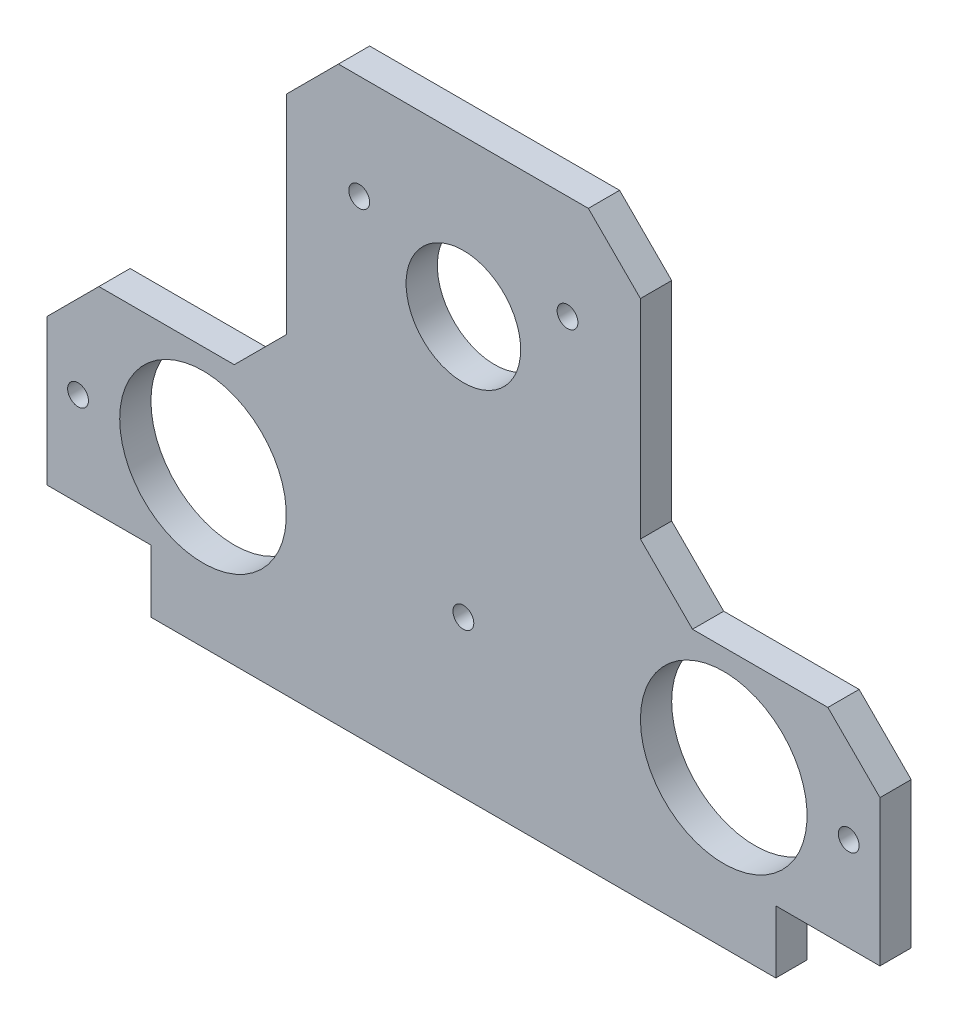
ISO-10303-21;
HEADER;
FILE_DESCRIPTION(('STEP AP214'),'2;1');
FILE_NAME('part.step','',(''),(''),'','','');
FILE_SCHEMA(('AUTOMOTIVE_DESIGN { 1 0 10303 214 1 1 1 1 }'));
ENDSEC;
DATA;
#1=APPLICATION_CONTEXT('core data for automotive mechanical design processes');
#2=APPLICATION_PROTOCOL_DEFINITION('international standard','automotive_design',2000,#1);
#3=PRODUCT_CONTEXT('',#1,'mechanical');
#4=PRODUCT('Part','Part','',(#3));
#5=PRODUCT_RELATED_PRODUCT_CATEGORY('part','',(#4));
#6=PRODUCT_DEFINITION_FORMATION('','',#4);
#7=PRODUCT_DEFINITION_CONTEXT('part definition',#1,'design');
#8=PRODUCT_DEFINITION('design','',#6,#7);
#9=PRODUCT_DEFINITION_SHAPE('','',#8);
#10=(LENGTH_UNIT() NAMED_UNIT(*) SI_UNIT(.MILLI.,.METRE.));
#11=(NAMED_UNIT(*) PLANE_ANGLE_UNIT() SI_UNIT($,.RADIAN.));
#12=(NAMED_UNIT(*) SI_UNIT($,.STERADIAN.) SOLID_ANGLE_UNIT());
#13=UNCERTAINTY_MEASURE_WITH_UNIT(LENGTH_MEASURE(1.E-05),#10,'distance_accuracy_value','');
#14=(GEOMETRIC_REPRESENTATION_CONTEXT(3) GLOBAL_UNCERTAINTY_ASSIGNED_CONTEXT((#13)) GLOBAL_UNIT_ASSIGNED_CONTEXT((#10,
#11,#12)) REPRESENTATION_CONTEXT('',''));
#15=CARTESIAN_POINT('',(0.,0.,0.));
#16=DIRECTION('',(0.,0.,1.));
#17=DIRECTION('',(1.,0.,0.));
#18=AXIS2_PLACEMENT_3D('',#15,#16,#17);
#19=CARTESIAN_POINT('',(0.,0.,0.));
#20=DIRECTION('',(0.,0.,1.));
#21=DIRECTION('',(1.,0.,0.));
#22=AXIS2_PLACEMENT_3D('',#19,#20,#21);
#23=PLANE('',#22);
#24=CARTESIAN_POINT('',(0.,15.,0.));
#25=DIRECTION('',(0.,0.,-1.));
#26=DIRECTION('',(-1.,0.,0.));
#27=AXIS2_PLACEMENT_3D('',#24,#25,#26);
#28=CIRCLE('',#27,1.);
#29=CARTESIAN_POINT('',(-1.,15.,0.));
#30=VERTEX_POINT('',#29);
#31=EDGE_CURVE('E341',#30,#30,#28,.T.);
#32=ORIENTED_EDGE('',*,*,#31,.F.);
#33=EDGE_LOOP('',(#32));
#34=FACE_BOUND('',#33,.T.);
#35=CARTESIAN_POINT('',(-37.,15.,0.));
#36=DIRECTION('',(0.,0.,-1.));
#37=DIRECTION('',(1.,0.,0.));
#38=AXIS2_PLACEMENT_3D('',#35,#36,#37);
#39=CIRCLE('',#38,0.999999999999998);
#40=CARTESIAN_POINT('',(-36.,15.,0.));
#41=VERTEX_POINT('',#40);
#42=EDGE_CURVE('E240',#41,#41,#39,.T.);
#43=ORIENTED_EDGE('',*,*,#42,.F.);
#44=EDGE_LOOP('',(#43));
#45=FACE_BOUND('',#44,.T.);
#46=CARTESIAN_POINT('',(37.,15.,0.));
#47=DIRECTION('',(0.,0.,-1.));
#48=DIRECTION('',(-1.,0.,0.));
#49=AXIS2_PLACEMENT_3D('',#46,#47,#48);
#50=CIRCLE('',#49,0.999999999999998);
#51=CARTESIAN_POINT('',(36.,15.,0.));
#52=VERTEX_POINT('',#51);
#53=EDGE_CURVE('E235',#52,#52,#50,.T.);
#54=ORIENTED_EDGE('',*,*,#53,.F.);
#55=EDGE_LOOP('',(#54));
#56=FACE_BOUND('',#55,.T.);
#57=CARTESIAN_POINT('',(-9.99999999999999,45.,0.));
#58=DIRECTION('',(0.,0.,-1.));
#59=DIRECTION('',(1.,0.,0.));
#60=AXIS2_PLACEMENT_3D('',#57,#58,#59);
#61=CIRCLE('',#60,1.);
#62=CARTESIAN_POINT('',(-8.99999999999999,45.,0.));
#63=VERTEX_POINT('',#62);
#64=EDGE_CURVE('E229',#63,#63,#61,.T.);
#65=ORIENTED_EDGE('',*,*,#64,.F.);
#66=EDGE_LOOP('',(#65));
#67=FACE_BOUND('',#66,.T.);
#68=CARTESIAN_POINT('',(10.,45.,0.));
#69=DIRECTION('',(0.,0.,-1.));
#70=DIRECTION('',(-1.,0.,0.));
#71=AXIS2_PLACEMENT_3D('',#68,#69,#70);
#72=CIRCLE('',#71,1.);
#73=CARTESIAN_POINT('',(9.,45.,0.));
#74=VERTEX_POINT('',#73);
#75=EDGE_CURVE('E226',#74,#74,#72,.T.);
#76=ORIENTED_EDGE('',*,*,#75,.F.);
#77=EDGE_LOOP('',(#76));
#78=FACE_BOUND('',#77,.T.);
#79=CARTESIAN_POINT('',(-25.,15.,0.));
#80=DIRECTION('',(0.,0.,-1.));
#81=DIRECTION('',(1.,0.,0.));
#82=AXIS2_PLACEMENT_3D('',#79,#80,#81);
#83=CIRCLE('',#82,8.);
#84=CARTESIAN_POINT('',(-17.,15.,0.));
#85=VERTEX_POINT('',#84);
#86=EDGE_CURVE('E268',#85,#85,#83,.T.);
#87=ORIENTED_EDGE('',*,*,#86,.F.);
#88=EDGE_LOOP('',(#87));
#89=FACE_BOUND('',#88,.T.);
#90=CARTESIAN_POINT('',(25.,15.,0.));
#91=DIRECTION('',(0.,0.,-1.));
#92=DIRECTION('',(-1.,0.,0.));
#93=AXIS2_PLACEMENT_3D('',#90,#91,#92);
#94=CIRCLE('',#93,8.);
#95=CARTESIAN_POINT('',(17.,15.,0.));
#96=VERTEX_POINT('',#95);
#97=EDGE_CURVE('E276',#96,#96,#94,.T.);
#98=ORIENTED_EDGE('',*,*,#97,.F.);
#99=EDGE_LOOP('',(#98));
#100=FACE_BOUND('',#99,.T.);
#101=DIRECTION('',(-1.,0.,0.));
#102=VECTOR('',#101,1.);
#103=CARTESIAN_POINT('',(17.,55.,0.));
#104=LINE('',#103,#102);
#105=CARTESIAN_POINT('',(12.,55.,0.));
#106=VERTEX_POINT('',#105);
#107=CARTESIAN_POINT('',(-12.,55.,0.));
#108=VERTEX_POINT('',#107);
#109=EDGE_CURVE('E190',#106,#108,#104,.T.);
#110=ORIENTED_EDGE('',*,*,#109,.F.);
#111=DIRECTION('',(-0.707106781186547,0.707106781186549,0.));
#112=VECTOR('',#111,1.);
#113=CARTESIAN_POINT('',(12.,55.,0.));
#114=LINE('',#113,#112);
#115=CARTESIAN_POINT('',(17.,50.,0.));
#116=VERTEX_POINT('',#115);
#117=EDGE_CURVE('E185',#106,#116,#114,.F.);
#118=ORIENTED_EDGE('',*,*,#117,.T.);
#119=DIRECTION('',(0.,1.,0.));
#120=VECTOR('',#119,1.);
#121=CARTESIAN_POINT('',(17.,25.,0.));
#122=LINE('',#121,#120);
#123=CARTESIAN_POINT('',(17.,30.,0.));
#124=VERTEX_POINT('',#123);
#125=EDGE_CURVE('E301',#124,#116,#122,.T.);
#126=ORIENTED_EDGE('',*,*,#125,.F.);
#127=DIRECTION('',(-0.707106781186544,0.707106781186551,0.));
#128=VECTOR('',#127,1.);
#129=CARTESIAN_POINT('',(23.5000000000001,23.4999999999998,0.));
#130=LINE('',#129,#128);
#131=CARTESIAN_POINT('',(22.,25.,0.));
#132=VERTEX_POINT('',#131);
#133=EDGE_CURVE('E42',#124,#132,#130,.F.);
#134=ORIENTED_EDGE('',*,*,#133,.T.);
#135=DIRECTION('',(-1.,0.,0.));
#136=VECTOR('',#135,1.);
#137=CARTESIAN_POINT('',(40.,25.,0.));
#138=LINE('',#137,#136);
#139=CARTESIAN_POINT('',(35.,25.,0.));
#140=VERTEX_POINT('',#139);
#141=EDGE_CURVE('E298',#140,#132,#138,.T.);
#142=ORIENTED_EDGE('',*,*,#141,.F.);
#143=DIRECTION('',(-0.707106781186546,0.70710678118655,0.));
#144=VECTOR('',#143,1.);
#145=CARTESIAN_POINT('',(35.,25.,0.));
#146=LINE('',#145,#144);
#147=CARTESIAN_POINT('',(40.,20.,0.));
#148=VERTEX_POINT('',#147);
#149=EDGE_CURVE('E58',#140,#148,#146,.F.);
#150=ORIENTED_EDGE('',*,*,#149,.T.);
#151=DIRECTION('',(0.,1.,0.));
#152=VECTOR('',#151,1.);
#153=CARTESIAN_POINT('',(40.,0.,0.));
#154=LINE('',#153,#152);
#155=CARTESIAN_POINT('',(40.,6.,0.));
#156=VERTEX_POINT('',#155);
#157=EDGE_CURVE('E296',#156,#148,#154,.T.);
#158=ORIENTED_EDGE('',*,*,#157,.F.);
#159=DIRECTION('',(-1.,0.,0.));
#160=VECTOR('',#159,1.);
#161=CARTESIAN_POINT('',(40.,6.,0.));
#162=LINE('',#161,#160);
#163=CARTESIAN_POINT('',(30.,6.,0.));
#164=VERTEX_POINT('',#163);
#165=EDGE_CURVE('E225',#156,#164,#162,.T.);
#166=ORIENTED_EDGE('',*,*,#165,.T.);
#167=DIRECTION('',(0.,-1.,0.));
#168=VECTOR('',#167,1.);
#169=CARTESIAN_POINT('',(30.,0.,0.));
#170=LINE('',#169,#168);
#171=CARTESIAN_POINT('',(30.,0.,0.));
#172=VERTEX_POINT('',#171);
#173=EDGE_CURVE('E246',#164,#172,#170,.T.);
#174=ORIENTED_EDGE('',*,*,#173,.T.);
#175=DIRECTION('',(1.,0.,0.));
#176=VECTOR('',#175,1.);
#177=CARTESIAN_POINT('',(-40.,0.,0.));
#178=LINE('',#177,#176);
#179=CARTESIAN_POINT('',(-30.,0.,0.));
#180=VERTEX_POINT('',#179);
#181=EDGE_CURVE('E293',#180,#172,#178,.T.);
#182=ORIENTED_EDGE('',*,*,#181,.F.);
#183=DIRECTION('',(0.,1.,0.));
#184=VECTOR('',#183,1.);
#185=CARTESIAN_POINT('',(-30.,0.,0.));
#186=LINE('',#185,#184);
#187=CARTESIAN_POINT('',(-30.,6.,0.));
#188=VERTEX_POINT('',#187);
#189=EDGE_CURVE('E253',#180,#188,#186,.T.);
#190=ORIENTED_EDGE('',*,*,#189,.T.);
#191=DIRECTION('',(-1.,0.,0.));
#192=VECTOR('',#191,1.);
#193=CARTESIAN_POINT('',(-40.,6.,0.));
#194=LINE('',#193,#192);
#195=CARTESIAN_POINT('',(-40.,6.,0.));
#196=VERTEX_POINT('',#195);
#197=EDGE_CURVE('E261',#188,#196,#194,.T.);
#198=ORIENTED_EDGE('',*,*,#197,.T.);
#199=DIRECTION('',(0.,-1.,0.));
#200=VECTOR('',#199,1.);
#201=CARTESIAN_POINT('',(-40.,0.,0.));
#202=LINE('',#201,#200);
#203=CARTESIAN_POINT('',(-40.,20.,0.));
#204=VERTEX_POINT('',#203);
#205=EDGE_CURVE('E291',#204,#196,#202,.T.);
#206=ORIENTED_EDGE('',*,*,#205,.F.);
#207=DIRECTION('',(-0.707106781186549,-0.707106781186546,0.));
#208=VECTOR('',#207,1.);
#209=CARTESIAN_POINT('',(-40.,20.,0.));
#210=LINE('',#209,#208);
#211=CARTESIAN_POINT('',(-35.,25.,0.));
#212=VERTEX_POINT('',#211);
#213=EDGE_CURVE('E187',#204,#212,#210,.F.);
#214=ORIENTED_EDGE('',*,*,#213,.T.);
#215=DIRECTION('',(-1.,0.,0.));
#216=VECTOR('',#215,1.);
#217=CARTESIAN_POINT('',(-40.,25.,0.));
#218=LINE('',#217,#216);
#219=CARTESIAN_POINT('',(-22.,25.,0.));
#220=VERTEX_POINT('',#219);
#221=EDGE_CURVE('E288',#220,#212,#218,.T.);
#222=ORIENTED_EDGE('',*,*,#221,.F.);
#223=DIRECTION('',(-0.707106781186551,-0.707106781186544,0.));
#224=VECTOR('',#223,1.);
#225=CARTESIAN_POINT('',(-23.4999999999999,23.5000000000001,0.));
#226=LINE('',#225,#224);
#227=CARTESIAN_POINT('',(-17.,30.,0.));
#228=VERTEX_POINT('',#227);
#229=EDGE_CURVE('E11',#220,#228,#226,.F.);
#230=ORIENTED_EDGE('',*,*,#229,.T.);
#231=DIRECTION('',(0.,-1.,0.));
#232=VECTOR('',#231,1.);
#233=CARTESIAN_POINT('',(-17.,25.,0.));
#234=LINE('',#233,#232);
#235=CARTESIAN_POINT('',(-17.,50.,0.));
#236=VERTEX_POINT('',#235);
#237=EDGE_CURVE('E283',#236,#228,#234,.T.);
#238=ORIENTED_EDGE('',*,*,#237,.F.);
#239=DIRECTION('',(-0.707106781186548,-0.707106781186548,0.));
#240=VECTOR('',#239,1.);
#241=CARTESIAN_POINT('',(-17.,50.,0.));
#242=LINE('',#241,#240);
#243=EDGE_CURVE('E195',#236,#108,#242,.F.);
#244=ORIENTED_EDGE('',*,*,#243,.T.);
#245=EDGE_LOOP('',(#110,#118,#126,#134,#142,#150,#158,#166,#174,#182,#190,#198,#206,#214,#222,
#230,#238,#244));
#246=FACE_BOUND('',#245,.T.);
#247=CARTESIAN_POINT('',(0.,40.,0.));
#248=DIRECTION('',(0.,0.,1.));
#249=DIRECTION('',(1.,0.,0.));
#250=AXIS2_PLACEMENT_3D('',#247,#248,#249);
#251=CIRCLE('',#250,5.5);
#252=CARTESIAN_POINT('',(5.5,40.,0.));
#253=VERTEX_POINT('',#252);
#254=EDGE_CURVE('E279',#253,#253,#251,.T.);
#255=ORIENTED_EDGE('',*,*,#254,.T.);
#256=EDGE_LOOP('',(#255));
#257=FACE_BOUND('',#256,.T.);
#258=ADVANCED_FACE('F33',(#34,#45,#56,#67,#78,#89,#100,#246,#257),#23,.F.);
#259=CARTESIAN_POINT('',(-17.,25.,12.));
#260=DIRECTION('',(1.,0.,0.));
#261=DIRECTION('',(0.,1.,0.));
#262=AXIS2_PLACEMENT_3D('',#259,#260,#261);
#263=PLANE('',#262);
#264=DIRECTION('',(0.,0.,1.));
#265=VECTOR('',#264,1.);
#266=CARTESIAN_POINT('',(-17.,30.,12.));
#267=LINE('',#266,#265);
#268=CARTESIAN_POINT('',(-17.,30.,3.));
#269=VERTEX_POINT('',#268);
#270=EDGE_CURVE('E202',#228,#269,#267,.T.);
#271=ORIENTED_EDGE('',*,*,#270,.T.);
#272=DIRECTION('',(0.,1.,0.));
#273=VECTOR('',#272,1.);
#274=CARTESIAN_POINT('',(-17.,25.,3.));
#275=LINE('',#274,#273);
#276=CARTESIAN_POINT('',(-17.,50.,3.));
#277=VERTEX_POINT('',#276);
#278=EDGE_CURVE('E311',#269,#277,#275,.T.);
#279=ORIENTED_EDGE('',*,*,#278,.T.);
#280=DIRECTION('',(0.,0.,-1.));
#281=VECTOR('',#280,1.);
#282=CARTESIAN_POINT('',(-17.,50.,12.));
#283=LINE('',#282,#281);
#284=EDGE_CURVE('E205',#277,#236,#283,.T.);
#285=ORIENTED_EDGE('',*,*,#284,.T.);
#286=ORIENTED_EDGE('',*,*,#237,.T.);
#287=EDGE_LOOP('',(#271,#279,#285,#286));
#288=FACE_BOUND('',#287,.T.);
#289=ADVANCED_FACE('F350',(#288),#263,.F.);
#290=CARTESIAN_POINT('',(-40.,25.,12.));
#291=DIRECTION('',(0.,-1.,0.));
#292=DIRECTION('',(1.,0.,0.));
#293=AXIS2_PLACEMENT_3D('',#290,#291,#292);
#294=PLANE('',#293);
#295=DIRECTION('',(0.,0.,1.));
#296=VECTOR('',#295,1.);
#297=CARTESIAN_POINT('',(-35.,25.,12.));
#298=LINE('',#297,#296);
#299=CARTESIAN_POINT('',(-35.,25.,3.));
#300=VERTEX_POINT('',#299);
#301=EDGE_CURVE('E215',#212,#300,#298,.T.);
#302=ORIENTED_EDGE('',*,*,#301,.T.);
#303=DIRECTION('',(1.,0.,0.));
#304=VECTOR('',#303,1.);
#305=CARTESIAN_POINT('',(-40.,25.,3.));
#306=LINE('',#305,#304);
#307=CARTESIAN_POINT('',(-22.,25.,3.));
#308=VERTEX_POINT('',#307);
#309=EDGE_CURVE('E50',#300,#308,#306,.T.);
#310=ORIENTED_EDGE('',*,*,#309,.T.);
#311=DIRECTION('',(0.,0.,-1.));
#312=VECTOR('',#311,1.);
#313=CARTESIAN_POINT('',(-22.,25.,0.));
#314=LINE('',#313,#312);
#315=EDGE_CURVE('E218',#308,#220,#314,.T.);
#316=ORIENTED_EDGE('',*,*,#315,.T.);
#317=ORIENTED_EDGE('',*,*,#221,.T.);
#318=EDGE_LOOP('',(#302,#310,#316,#317));
#319=FACE_BOUND('',#318,.T.);
#320=ADVANCED_FACE('F403',(#319),#294,.F.);
#321=CARTESIAN_POINT('',(-40.,0.,12.));
#322=DIRECTION('',(1.,0.,0.));
#323=DIRECTION('',(0.,0.,-1.));
#324=AXIS2_PLACEMENT_3D('',#321,#322,#323);
#325=PLANE('',#324);
#326=DIRECTION('',(0.,0.,1.));
#327=VECTOR('',#326,1.);
#328=CARTESIAN_POINT('',(-40.,6.,0.));
#329=LINE('',#328,#327);
#330=CARTESIAN_POINT('',(-40.,6.,3.));
#331=VERTEX_POINT('',#330);
#332=EDGE_CURVE('E265',#196,#331,#329,.T.);
#333=ORIENTED_EDGE('',*,*,#332,.T.);
#334=DIRECTION('',(0.,1.,0.));
#335=VECTOR('',#334,1.);
#336=CARTESIAN_POINT('',(-40.,0.,3.));
#337=LINE('',#336,#335);
#338=CARTESIAN_POINT('',(-40.,20.,3.));
#339=VERTEX_POINT('',#338);
#340=EDGE_CURVE('E449',#331,#339,#337,.T.);
#341=ORIENTED_EDGE('',*,*,#340,.T.);
#342=DIRECTION('',(0.,0.,-1.));
#343=VECTOR('',#342,1.);
#344=CARTESIAN_POINT('',(-40.,20.,12.));
#345=LINE('',#344,#343);
#346=EDGE_CURVE('E220',#339,#204,#345,.T.);
#347=ORIENTED_EDGE('',*,*,#346,.T.);
#348=ORIENTED_EDGE('',*,*,#205,.T.);
#349=EDGE_LOOP('',(#333,#341,#347,#348));
#350=FACE_BOUND('',#349,.T.);
#351=ADVANCED_FACE('F399',(#350),#325,.F.);
#352=CARTESIAN_POINT('',(-40.,0.,12.));
#353=DIRECTION('',(0.,1.,0.));
#354=DIRECTION('',(0.,0.,1.));
#355=AXIS2_PLACEMENT_3D('',#352,#353,#354);
#356=PLANE('',#355);
#357=DIRECTION('',(0.,0.,1.));
#358=VECTOR('',#357,1.);
#359=CARTESIAN_POINT('',(30.,0.,0.));
#360=LINE('',#359,#358);
#361=CARTESIAN_POINT('',(30.,0.,3.));
#362=VERTEX_POINT('',#361);
#363=EDGE_CURVE('E250',#172,#362,#360,.T.);
#364=ORIENTED_EDGE('',*,*,#363,.T.);
#365=DIRECTION('',(-1.,0.,0.));
#366=VECTOR('',#365,1.);
#367=CARTESIAN_POINT('',(-40.,0.,3.));
#368=LINE('',#367,#366);
#369=CARTESIAN_POINT('',(-30.,0.,3.));
#370=VERTEX_POINT('',#369);
#371=EDGE_CURVE('E182',#362,#370,#368,.T.);
#372=ORIENTED_EDGE('',*,*,#371,.T.);
#373=DIRECTION('',(0.,0.,1.));
#374=VECTOR('',#373,1.);
#375=CARTESIAN_POINT('',(-30.,0.,0.));
#376=LINE('',#375,#374);
#377=EDGE_CURVE('E264',#180,#370,#376,.T.);
#378=ORIENTED_EDGE('',*,*,#377,.F.);
#379=ORIENTED_EDGE('',*,*,#181,.T.);
#380=EDGE_LOOP('',(#364,#372,#378,#379));
#381=FACE_BOUND('',#380,.T.);
#382=ADVANCED_FACE('F395',(#381),#356,.F.);
#383=CARTESIAN_POINT('',(40.,0.,12.));
#384=DIRECTION('',(-1.,0.,0.));
#385=DIRECTION('',(0.,0.,1.));
#386=AXIS2_PLACEMENT_3D('',#383,#384,#385);
#387=PLANE('',#386);
#388=DIRECTION('',(0.,0.,1.));
#389=VECTOR('',#388,1.);
#390=CARTESIAN_POINT('',(40.,20.,12.));
#391=LINE('',#390,#389);
#392=CARTESIAN_POINT('',(40.,20.,3.));
#393=VERTEX_POINT('',#392);
#394=EDGE_CURVE('E212',#148,#393,#391,.T.);
#395=ORIENTED_EDGE('',*,*,#394,.T.);
#396=DIRECTION('',(0.,1.,0.));
#397=VECTOR('',#396,1.);
#398=CARTESIAN_POINT('',(40.,0.,3.));
#399=LINE('',#398,#397);
#400=CARTESIAN_POINT('',(40.,6.,3.));
#401=VERTEX_POINT('',#400);
#402=EDGE_CURVE('E447',#401,#393,#399,.T.);
#403=ORIENTED_EDGE('',*,*,#402,.F.);
#404=DIRECTION('',(0.,0.,1.));
#405=VECTOR('',#404,1.);
#406=CARTESIAN_POINT('',(40.,6.,0.));
#407=LINE('',#406,#405);
#408=EDGE_CURVE('E249',#156,#401,#407,.T.);
#409=ORIENTED_EDGE('',*,*,#408,.F.);
#410=ORIENTED_EDGE('',*,*,#157,.T.);
#411=EDGE_LOOP('',(#395,#403,#409,#410));
#412=FACE_BOUND('',#411,.T.);
#413=ADVANCED_FACE('F391',(#412),#387,.F.);
#414=CARTESIAN_POINT('',(40.,25.,12.));
#415=DIRECTION('',(0.,-1.,0.));
#416=DIRECTION('',(1.,0.,0.));
#417=AXIS2_PLACEMENT_3D('',#414,#415,#416);
#418=PLANE('',#417);
#419=DIRECTION('',(0.,0.,1.));
#420=VECTOR('',#419,1.);
#421=CARTESIAN_POINT('',(22.,25.,12.));
#422=LINE('',#421,#420);
#423=CARTESIAN_POINT('',(22.,25.,3.));
#424=VERTEX_POINT('',#423);
#425=EDGE_CURVE('E207',#132,#424,#422,.T.);
#426=ORIENTED_EDGE('',*,*,#425,.T.);
#427=DIRECTION('',(1.,0.,0.));
#428=VECTOR('',#427,1.);
#429=CARTESIAN_POINT('',(40.,25.,3.));
#430=LINE('',#429,#428);
#431=CARTESIAN_POINT('',(35.,25.,3.));
#432=VERTEX_POINT('',#431);
#433=EDGE_CURVE('E320',#424,#432,#430,.T.);
#434=ORIENTED_EDGE('',*,*,#433,.T.);
#435=DIRECTION('',(0.,0.,-1.));
#436=VECTOR('',#435,1.);
#437=CARTESIAN_POINT('',(35.,25.,12.));
#438=LINE('',#437,#436);
#439=EDGE_CURVE('E210',#432,#140,#438,.T.);
#440=ORIENTED_EDGE('',*,*,#439,.T.);
#441=ORIENTED_EDGE('',*,*,#141,.T.);
#442=EDGE_LOOP('',(#426,#434,#440,#441));
#443=FACE_BOUND('',#442,.T.);
#444=ADVANCED_FACE('F387',(#443),#418,.F.);
#445=CARTESIAN_POINT('',(17.,25.,12.));
#446=DIRECTION('',(-1.,0.,0.));
#447=DIRECTION('',(0.,-1.,0.));
#448=AXIS2_PLACEMENT_3D('',#445,#446,#447);
#449=PLANE('',#448);
#450=DIRECTION('',(0.,0.,1.));
#451=VECTOR('',#450,1.);
#452=CARTESIAN_POINT('',(17.,50.,12.));
#453=LINE('',#452,#451);
#454=CARTESIAN_POINT('',(17.,50.,3.));
#455=VERTEX_POINT('',#454);
#456=EDGE_CURVE('E200',#116,#455,#453,.T.);
#457=ORIENTED_EDGE('',*,*,#456,.T.);
#458=DIRECTION('',(0.,-1.,0.));
#459=VECTOR('',#458,1.);
#460=CARTESIAN_POINT('',(17.,25.,3.));
#461=LINE('',#460,#459);
#462=CARTESIAN_POINT('',(17.,30.,3.));
#463=VERTEX_POINT('',#462);
#464=EDGE_CURVE('E166',#455,#463,#461,.T.);
#465=ORIENTED_EDGE('',*,*,#464,.T.);
#466=DIRECTION('',(0.,0.,-1.));
#467=VECTOR('',#466,1.);
#468=CARTESIAN_POINT('',(17.,30.,0.));
#469=LINE('',#468,#467);
#470=EDGE_CURVE('E198',#463,#124,#469,.T.);
#471=ORIENTED_EDGE('',*,*,#470,.T.);
#472=ORIENTED_EDGE('',*,*,#125,.T.);
#473=EDGE_LOOP('',(#457,#465,#471,#472));
#474=FACE_BOUND('',#473,.T.);
#475=ADVANCED_FACE('F384',(#474),#449,.F.);
#476=CARTESIAN_POINT('',(17.,55.,12.));
#477=DIRECTION('',(0.,-1.,0.));
#478=DIRECTION('',(1.,0.,0.));
#479=AXIS2_PLACEMENT_3D('',#476,#477,#478);
#480=PLANE('',#479);
#481=DIRECTION('',(0.,0.,1.));
#482=VECTOR('',#481,1.);
#483=CARTESIAN_POINT('',(-12.,55.,12.));
#484=LINE('',#483,#482);
#485=CARTESIAN_POINT('',(-12.,55.,3.));
#486=VERTEX_POINT('',#485);
#487=EDGE_CURVE('E181',#108,#486,#484,.T.);
#488=ORIENTED_EDGE('',*,*,#487,.T.);
#489=DIRECTION('',(-1.,0.,0.));
#490=VECTOR('',#489,1.);
#491=CARTESIAN_POINT('',(-40.,55.,3.));
#492=LINE('',#491,#490);
#493=CARTESIAN_POINT('',(12.,55.,3.));
#494=VERTEX_POINT('',#493);
#495=EDGE_CURVE('E163',#494,#486,#492,.T.);
#496=ORIENTED_EDGE('',*,*,#495,.F.);
#497=DIRECTION('',(0.,0.,-1.));
#498=VECTOR('',#497,1.);
#499=CARTESIAN_POINT('',(12.,55.,12.));
#500=LINE('',#499,#498);
#501=EDGE_CURVE('E178',#494,#106,#500,.T.);
#502=ORIENTED_EDGE('',*,*,#501,.T.);
#503=ORIENTED_EDGE('',*,*,#109,.T.);
#504=EDGE_LOOP('',(#488,#496,#502,#503));
#505=FACE_BOUND('',#504,.T.);
#506=ADVANCED_FACE('F176',(#505),#480,.F.);
#507=CARTESIAN_POINT('',(0.,40.,3.));
#508=DIRECTION('',(0.,0.,1.));
#509=DIRECTION('',(1.,0.,0.));
#510=AXIS2_PLACEMENT_3D('',#507,#508,#509);
#511=PLANE('',#510);
#512=CARTESIAN_POINT('',(-9.99999999999999,45.,3.));
#513=DIRECTION('',(0.,0.,1.));
#514=DIRECTION('',(1.,0.,0.));
#515=AXIS2_PLACEMENT_3D('',#512,#513,#514);
#516=CIRCLE('',#515,1.);
#517=CARTESIAN_POINT('',(-8.99999999999999,45.,3.));
#518=VERTEX_POINT('',#517);
#519=EDGE_CURVE('E227',#518,#518,#516,.T.);
#520=ORIENTED_EDGE('',*,*,#519,.F.);
#521=EDGE_LOOP('',(#520));
#522=FACE_BOUND('',#521,.T.);
#523=CARTESIAN_POINT('',(10.,45.,3.));
#524=DIRECTION('',(0.,0.,1.));
#525=DIRECTION('',(1.,0.,0.));
#526=AXIS2_PLACEMENT_3D('',#523,#524,#525);
#527=CIRCLE('',#526,1.);
#528=CARTESIAN_POINT('',(11.,45.,3.));
#529=VERTEX_POINT('',#528);
#530=EDGE_CURVE('E223',#529,#529,#527,.T.);
#531=ORIENTED_EDGE('',*,*,#530,.F.);
#532=EDGE_LOOP('',(#531));
#533=FACE_BOUND('',#532,.T.);
#534=CARTESIAN_POINT('',(0.,40.,3.));
#535=DIRECTION('',(0.,0.,1.));
#536=DIRECTION('',(1.,0.,0.));
#537=AXIS2_PLACEMENT_3D('',#534,#535,#536);
#538=CIRCLE('',#537,5.5);
#539=CARTESIAN_POINT('',(5.5,40.,3.));
#540=VERTEX_POINT('',#539);
#541=EDGE_CURVE('E280',#540,#540,#538,.T.);
#542=ORIENTED_EDGE('',*,*,#541,.F.);
#543=EDGE_LOOP('',(#542));
#544=FACE_BOUND('',#543,.T.);
#545=CARTESIAN_POINT('',(-25.,15.,3.));
#546=DIRECTION('',(0.,0.,-1.));
#547=DIRECTION('',(-1.,0.,0.));
#548=AXIS2_PLACEMENT_3D('',#545,#546,#547);
#549=CIRCLE('',#548,8.);
#550=CARTESIAN_POINT('',(-33.,15.,3.));
#551=VERTEX_POINT('',#550);
#552=EDGE_CURVE('E335',#551,#551,#549,.F.);
#553=ORIENTED_EDGE('',*,*,#552,.F.);
#554=EDGE_LOOP('',(#553));
#555=FACE_BOUND('',#554,.T.);
#556=CARTESIAN_POINT('',(-37.,15.,3.));
#557=DIRECTION('',(0.,0.,-1.));
#558=DIRECTION('',(-1.,0.,0.));
#559=AXIS2_PLACEMENT_3D('',#556,#557,#558);
#560=CIRCLE('',#559,0.999999999999998);
#561=CARTESIAN_POINT('',(-38.,15.,3.));
#562=VERTEX_POINT('',#561);
#563=EDGE_CURVE('E444',#562,#562,#560,.F.);
#564=ORIENTED_EDGE('',*,*,#563,.F.);
#565=EDGE_LOOP('',(#564));
#566=FACE_BOUND('',#565,.T.);
#567=CARTESIAN_POINT('',(0.,15.,3.));
#568=DIRECTION('',(0.,0.,-1.));
#569=DIRECTION('',(-1.,0.,0.));
#570=AXIS2_PLACEMENT_3D('',#567,#568,#569);
#571=CIRCLE('',#570,1.);
#572=CARTESIAN_POINT('',(-1.,15.,3.));
#573=VERTEX_POINT('',#572);
#574=EDGE_CURVE('E37',#573,#573,#571,.F.);
#575=ORIENTED_EDGE('',*,*,#574,.F.);
#576=EDGE_LOOP('',(#575));
#577=FACE_BOUND('',#576,.T.);
#578=CARTESIAN_POINT('',(37.,15.,3.));
#579=DIRECTION('',(0.,0.,-1.));
#580=DIRECTION('',(-1.,0.,0.));
#581=AXIS2_PLACEMENT_3D('',#578,#579,#580);
#582=CIRCLE('',#581,0.999999999999998);
#583=CARTESIAN_POINT('',(36.,15.,3.));
#584=VERTEX_POINT('',#583);
#585=EDGE_CURVE('E439',#584,#584,#582,.F.);
#586=ORIENTED_EDGE('',*,*,#585,.F.);
#587=EDGE_LOOP('',(#586));
#588=FACE_BOUND('',#587,.T.);
#589=DIRECTION('',(0.,1.,0.));
#590=VECTOR('',#589,1.);
#591=CARTESIAN_POINT('',(-30.,0.,3.));
#592=LINE('',#591,#590);
#593=CARTESIAN_POINT('',(-30.,6.,3.));
#594=VERTEX_POINT('',#593);
#595=EDGE_CURVE('E329',#370,#594,#592,.T.);
#596=ORIENTED_EDGE('',*,*,#595,.F.);
#597=ORIENTED_EDGE('',*,*,#371,.F.);
#598=DIRECTION('',(0.,-1.,0.));
#599=VECTOR('',#598,1.);
#600=CARTESIAN_POINT('',(30.,0.,3.));
#601=LINE('',#600,#599);
#602=CARTESIAN_POINT('',(30.,6.,3.));
#603=VERTEX_POINT('',#602);
#604=EDGE_CURVE('E326',#603,#362,#601,.T.);
#605=ORIENTED_EDGE('',*,*,#604,.F.);
#606=DIRECTION('',(-1.,0.,0.));
#607=VECTOR('',#606,1.);
#608=CARTESIAN_POINT('',(40.,6.,3.));
#609=LINE('',#608,#607);
#610=EDGE_CURVE('E171',#401,#603,#609,.T.);
#611=ORIENTED_EDGE('',*,*,#610,.F.);
#612=ORIENTED_EDGE('',*,*,#402,.T.);
#613=DIRECTION('',(0.707106781186546,-0.70710678118655,0.));
#614=VECTOR('',#613,1.);
#615=CARTESIAN_POINT('',(35.,25.,3.));
#616=LINE('',#615,#614);
#617=EDGE_CURVE('E172',#393,#432,#616,.F.);
#618=ORIENTED_EDGE('',*,*,#617,.T.);
#619=ORIENTED_EDGE('',*,*,#433,.F.);
#620=DIRECTION('',(-0.707106781186544,0.707106781186551,0.));
#621=VECTOR('',#620,1.);
#622=CARTESIAN_POINT('',(17.,30.,3.));
#623=LINE('',#622,#621);
#624=EDGE_CURVE('E310',#463,#424,#623,.F.);
#625=ORIENTED_EDGE('',*,*,#624,.F.);
#626=ORIENTED_EDGE('',*,*,#464,.F.);
#627=DIRECTION('',(0.707106781186547,-0.707106781186549,0.));
#628=VECTOR('',#627,1.);
#629=CARTESIAN_POINT('',(12.,55.,3.));
#630=LINE('',#629,#628);
#631=EDGE_CURVE('E159',#455,#494,#630,.F.);
#632=ORIENTED_EDGE('',*,*,#631,.T.);
#633=ORIENTED_EDGE('',*,*,#495,.T.);
#634=DIRECTION('',(0.707106781186548,0.707106781186548,0.));
#635=VECTOR('',#634,1.);
#636=CARTESIAN_POINT('',(-17.,50.,3.));
#637=LINE('',#636,#635);
#638=EDGE_CURVE('E308',#486,#277,#637,.F.);
#639=ORIENTED_EDGE('',*,*,#638,.T.);
#640=ORIENTED_EDGE('',*,*,#278,.F.);
#641=DIRECTION('',(-0.707106781186551,-0.707106781186544,0.));
#642=VECTOR('',#641,1.);
#643=CARTESIAN_POINT('',(-22.,25.,3.));
#644=LINE('',#643,#642);
#645=EDGE_CURVE('E315',#308,#269,#644,.F.);
#646=ORIENTED_EDGE('',*,*,#645,.F.);
#647=ORIENTED_EDGE('',*,*,#309,.F.);
#648=DIRECTION('',(0.707106781186549,0.707106781186546,0.));
#649=VECTOR('',#648,1.);
#650=CARTESIAN_POINT('',(-40.,20.,3.));
#651=LINE('',#650,#649);
#652=EDGE_CURVE('E437',#300,#339,#651,.F.);
#653=ORIENTED_EDGE('',*,*,#652,.T.);
#654=ORIENTED_EDGE('',*,*,#340,.F.);
#655=DIRECTION('',(-1.,0.,0.));
#656=VECTOR('',#655,1.);
#657=CARTESIAN_POINT('',(-40.,6.,3.));
#658=LINE('',#657,#656);
#659=EDGE_CURVE('E332',#594,#331,#658,.T.);
#660=ORIENTED_EDGE('',*,*,#659,.F.);
#661=EDGE_LOOP('',(#596,#597,#605,#611,#612,#618,#619,#625,#626,#632,#633,#639,#640,#646,#647,
#653,#654,#660));
#662=FACE_BOUND('',#661,.T.);
#663=CARTESIAN_POINT('',(25.,15.,3.));
#664=DIRECTION('',(0.,0.,-1.));
#665=DIRECTION('',(-1.,0.,0.));
#666=AXIS2_PLACEMENT_3D('',#663,#664,#665);
#667=CIRCLE('',#666,8.);
#668=CARTESIAN_POINT('',(17.,15.,3.));
#669=VERTEX_POINT('',#668);
#670=EDGE_CURVE('E338',#669,#669,#667,.F.);
#671=ORIENTED_EDGE('',*,*,#670,.F.);
#672=EDGE_LOOP('',(#671));
#673=FACE_BOUND('',#672,.T.);
#674=ADVANCED_FACE('F161',(#522,#533,#544,#555,#566,#577,#588,#662,#673),#511,.T.);
#675=CARTESIAN_POINT('',(0.,40.,3.));
#676=DIRECTION('',(0.,0.,-1.));
#677=DIRECTION('',(-1.,0.,0.));
#678=AXIS2_PLACEMENT_3D('',#675,#676,#677);
#679=CYLINDRICAL_SURFACE('',#678,5.5);
#680=ORIENTED_EDGE('',*,*,#541,.T.);
#681=EDGE_LOOP('',(#680));
#682=FACE_BOUND('',#681,.T.);
#683=ORIENTED_EDGE('',*,*,#254,.F.);
#684=EDGE_LOOP('',(#683));
#685=FACE_BOUND('',#684,.T.);
#686=ADVANCED_FACE('F364',(#682,#685),#679,.F.);
#687=CARTESIAN_POINT('',(25.,15.,6.));
#688=DIRECTION('',(0.,0.,-1.));
#689=DIRECTION('',(-1.,0.,0.));
#690=AXIS2_PLACEMENT_3D('',#687,#688,#689);
#691=CYLINDRICAL_SURFACE('',#690,8.);
#692=ORIENTED_EDGE('',*,*,#670,.T.);
#693=EDGE_LOOP('',(#692));
#694=FACE_BOUND('',#693,.T.);
#695=ORIENTED_EDGE('',*,*,#97,.T.);
#696=EDGE_LOOP('',(#695));
#697=FACE_BOUND('',#696,.T.);
#698=ADVANCED_FACE('F366',(#694,#697),#691,.F.);
#699=CARTESIAN_POINT('',(-25.,15.,6.));
#700=DIRECTION('',(0.,0.,-1.));
#701=DIRECTION('',(-1.,0.,0.));
#702=AXIS2_PLACEMENT_3D('',#699,#700,#701);
#703=CYLINDRICAL_SURFACE('',#702,8.);
#704=ORIENTED_EDGE('',*,*,#552,.T.);
#705=EDGE_LOOP('',(#704));
#706=FACE_BOUND('',#705,.T.);
#707=ORIENTED_EDGE('',*,*,#86,.T.);
#708=EDGE_LOOP('',(#707));
#709=FACE_BOUND('',#708,.T.);
#710=ADVANCED_FACE('F374',(#706,#709),#703,.F.);
#711=CARTESIAN_POINT('',(-40.,6.,0.));
#712=DIRECTION('',(0.,1.,0.));
#713=DIRECTION('',(0.,0.,1.));
#714=AXIS2_PLACEMENT_3D('',#711,#712,#713);
#715=PLANE('',#714);
#716=DIRECTION('',(0.,0.,1.));
#717=VECTOR('',#716,1.);
#718=CARTESIAN_POINT('',(-30.,6.,0.));
#719=LINE('',#718,#717);
#720=EDGE_CURVE('E269',#188,#594,#719,.T.);
#721=ORIENTED_EDGE('',*,*,#720,.T.);
#722=ORIENTED_EDGE('',*,*,#659,.T.);
#723=ORIENTED_EDGE('',*,*,#332,.F.);
#724=ORIENTED_EDGE('',*,*,#197,.F.);
#725=EDGE_LOOP('',(#721,#722,#723,#724));
#726=FACE_BOUND('',#725,.T.);
#727=ADVANCED_FACE('F480',(#726),#715,.F.);
#728=CARTESIAN_POINT('',(-30.,0.,0.));
#729=DIRECTION('',(1.,0.,0.));
#730=DIRECTION('',(0.,0.,-1.));
#731=AXIS2_PLACEMENT_3D('',#728,#729,#730);
#732=PLANE('',#731);
#733=ORIENTED_EDGE('',*,*,#377,.T.);
#734=ORIENTED_EDGE('',*,*,#595,.T.);
#735=ORIENTED_EDGE('',*,*,#720,.F.);
#736=ORIENTED_EDGE('',*,*,#189,.F.);
#737=EDGE_LOOP('',(#733,#734,#735,#736));
#738=FACE_BOUND('',#737,.T.);
#739=ADVANCED_FACE('F456',(#738),#732,.F.);
#740=CARTESIAN_POINT('',(30.,0.,0.));
#741=DIRECTION('',(-1.,0.,0.));
#742=DIRECTION('',(0.,0.,1.));
#743=AXIS2_PLACEMENT_3D('',#740,#741,#742);
#744=PLANE('',#743);
#745=DIRECTION('',(0.,0.,1.));
#746=VECTOR('',#745,1.);
#747=CARTESIAN_POINT('',(30.,6.,0.));
#748=LINE('',#747,#746);
#749=EDGE_CURVE('E254',#164,#603,#748,.T.);
#750=ORIENTED_EDGE('',*,*,#749,.T.);
#751=ORIENTED_EDGE('',*,*,#604,.T.);
#752=ORIENTED_EDGE('',*,*,#363,.F.);
#753=ORIENTED_EDGE('',*,*,#173,.F.);
#754=EDGE_LOOP('',(#750,#751,#752,#753));
#755=FACE_BOUND('',#754,.T.);
#756=ADVANCED_FACE('F461',(#755),#744,.F.);
#757=CARTESIAN_POINT('',(40.,6.,0.));
#758=DIRECTION('',(0.,1.,0.));
#759=DIRECTION('',(0.,0.,1.));
#760=AXIS2_PLACEMENT_3D('',#757,#758,#759);
#761=PLANE('',#760);
#762=ORIENTED_EDGE('',*,*,#408,.T.);
#763=ORIENTED_EDGE('',*,*,#610,.T.);
#764=ORIENTED_EDGE('',*,*,#749,.F.);
#765=ORIENTED_EDGE('',*,*,#165,.F.);
#766=EDGE_LOOP('',(#762,#763,#764,#765));
#767=FACE_BOUND('',#766,.T.);
#768=ADVANCED_FACE('F413',(#767),#761,.F.);
#769=CARTESIAN_POINT('',(12.,55.,12.));
#770=DIRECTION('',(-0.707106781186549,-0.707106781186547,0.));
#771=DIRECTION('',(0.,0.,-1.));
#772=AXIS2_PLACEMENT_3D('',#769,#770,#771);
#773=PLANE('',#772);
#774=ORIENTED_EDGE('',*,*,#631,.F.);
#775=ORIENTED_EDGE('',*,*,#456,.F.);
#776=ORIENTED_EDGE('',*,*,#117,.F.);
#777=ORIENTED_EDGE('',*,*,#501,.F.);
#778=EDGE_LOOP('',(#774,#775,#776,#777));
#779=FACE_BOUND('',#778,.T.);
#780=ADVANCED_FACE('F184',(#779),#773,.F.);
#781=CARTESIAN_POINT('',(-17.,50.,12.));
#782=DIRECTION('',(0.707106781186547,-0.707106781186547,0.));
#783=DIRECTION('',(0.,0.,-1.));
#784=AXIS2_PLACEMENT_3D('',#781,#782,#783);
#785=PLANE('',#784);
#786=ORIENTED_EDGE('',*,*,#638,.F.);
#787=ORIENTED_EDGE('',*,*,#487,.F.);
#788=ORIENTED_EDGE('',*,*,#243,.F.);
#789=ORIENTED_EDGE('',*,*,#284,.F.);
#790=EDGE_LOOP('',(#786,#787,#788,#789));
#791=FACE_BOUND('',#790,.T.);
#792=ADVANCED_FACE('F305',(#791),#785,.F.);
#793=CARTESIAN_POINT('',(35.,25.,12.));
#794=DIRECTION('',(-0.707106781186549,-0.707106781186545,0.));
#795=DIRECTION('',(0.,0.,-1.));
#796=AXIS2_PLACEMENT_3D('',#793,#794,#795);
#797=PLANE('',#796);
#798=ORIENTED_EDGE('',*,*,#617,.F.);
#799=ORIENTED_EDGE('',*,*,#394,.F.);
#800=ORIENTED_EDGE('',*,*,#149,.F.);
#801=ORIENTED_EDGE('',*,*,#439,.F.);
#802=EDGE_LOOP('',(#798,#799,#800,#801));
#803=FACE_BOUND('',#802,.T.);
#804=ADVANCED_FACE('F416',(#803),#797,.F.);
#805=CARTESIAN_POINT('',(17.,30.,12.));
#806=DIRECTION('',(0.707106781186551,0.707106781186544,0.));
#807=DIRECTION('',(0.,0.,1.));
#808=AXIS2_PLACEMENT_3D('',#805,#806,#807);
#809=PLANE('',#808);
#810=ORIENTED_EDGE('',*,*,#470,.F.);
#811=ORIENTED_EDGE('',*,*,#624,.T.);
#812=ORIENTED_EDGE('',*,*,#425,.F.);
#813=ORIENTED_EDGE('',*,*,#133,.F.);
#814=EDGE_LOOP('',(#810,#811,#812,#813));
#815=FACE_BOUND('',#814,.T.);
#816=ADVANCED_FACE('F419',(#815),#809,.T.);
#817=CARTESIAN_POINT('',(-22.,25.,12.));
#818=DIRECTION('',(-0.707106781186544,0.707106781186551,0.));
#819=DIRECTION('',(0.,0.,1.));
#820=AXIS2_PLACEMENT_3D('',#817,#818,#819);
#821=PLANE('',#820);
#822=ORIENTED_EDGE('',*,*,#315,.F.);
#823=ORIENTED_EDGE('',*,*,#645,.T.);
#824=ORIENTED_EDGE('',*,*,#270,.F.);
#825=ORIENTED_EDGE('',*,*,#229,.F.);
#826=EDGE_LOOP('',(#822,#823,#824,#825));
#827=FACE_BOUND('',#826,.T.);
#828=ADVANCED_FACE('F422',(#827),#821,.T.);
#829=CARTESIAN_POINT('',(-40.,20.,12.));
#830=DIRECTION('',(0.707106781186545,-0.707106781186549,0.));
#831=DIRECTION('',(0.,0.,-1.));
#832=AXIS2_PLACEMENT_3D('',#829,#830,#831);
#833=PLANE('',#832);
#834=ORIENTED_EDGE('',*,*,#652,.F.);
#835=ORIENTED_EDGE('',*,*,#301,.F.);
#836=ORIENTED_EDGE('',*,*,#213,.F.);
#837=ORIENTED_EDGE('',*,*,#346,.F.);
#838=EDGE_LOOP('',(#834,#835,#836,#837));
#839=FACE_BOUND('',#838,.T.);
#840=ADVANCED_FACE('F35',(#839),#833,.F.);
#841=CARTESIAN_POINT('',(10.,45.,12.));
#842=DIRECTION('',(0.,0.,-1.));
#843=DIRECTION('',(-1.,0.,0.));
#844=AXIS2_PLACEMENT_3D('',#841,#842,#843);
#845=CYLINDRICAL_SURFACE('',#844,1.);
#846=ORIENTED_EDGE('',*,*,#530,.T.);
#847=EDGE_LOOP('',(#846));
#848=FACE_BOUND('',#847,.T.);
#849=ORIENTED_EDGE('',*,*,#75,.T.);
#850=EDGE_LOOP('',(#849));
#851=FACE_BOUND('',#850,.T.);
#852=ADVANCED_FACE('F429',(#848,#851),#845,.F.);
#853=CARTESIAN_POINT('',(-9.99999999999999,45.,12.));
#854=DIRECTION('',(0.,0.,-1.));
#855=DIRECTION('',(-1.,0.,0.));
#856=AXIS2_PLACEMENT_3D('',#853,#854,#855);
#857=CYLINDRICAL_SURFACE('',#856,1.);
#858=ORIENTED_EDGE('',*,*,#519,.T.);
#859=EDGE_LOOP('',(#858));
#860=FACE_BOUND('',#859,.T.);
#861=ORIENTED_EDGE('',*,*,#64,.T.);
#862=EDGE_LOOP('',(#861));
#863=FACE_BOUND('',#862,.T.);
#864=ADVANCED_FACE('F503',(#860,#863),#857,.F.);
#865=CARTESIAN_POINT('',(37.,15.,12.));
#866=DIRECTION('',(0.,0.,-1.));
#867=DIRECTION('',(-1.,0.,0.));
#868=AXIS2_PLACEMENT_3D('',#865,#866,#867);
#869=CYLINDRICAL_SURFACE('',#868,0.999999999999998);
#870=ORIENTED_EDGE('',*,*,#585,.T.);
#871=EDGE_LOOP('',(#870));
#872=FACE_BOUND('',#871,.T.);
#873=ORIENTED_EDGE('',*,*,#53,.T.);
#874=EDGE_LOOP('',(#873));
#875=FACE_BOUND('',#874,.T.);
#876=ADVANCED_FACE('F500',(#872,#875),#869,.F.);
#877=CARTESIAN_POINT('',(-37.,15.,12.));
#878=DIRECTION('',(0.,0.,-1.));
#879=DIRECTION('',(-1.,0.,0.));
#880=AXIS2_PLACEMENT_3D('',#877,#878,#879);
#881=CYLINDRICAL_SURFACE('',#880,0.999999999999998);
#882=ORIENTED_EDGE('',*,*,#563,.T.);
#883=EDGE_LOOP('',(#882));
#884=FACE_BOUND('',#883,.T.);
#885=ORIENTED_EDGE('',*,*,#42,.T.);
#886=EDGE_LOOP('',(#885));
#887=FACE_BOUND('',#886,.T.);
#888=ADVANCED_FACE('F346',(#884,#887),#881,.F.);
#889=CARTESIAN_POINT('',(0.,15.,12.));
#890=DIRECTION('',(0.,0.,-1.));
#891=DIRECTION('',(-1.,0.,0.));
#892=AXIS2_PLACEMENT_3D('',#889,#890,#891);
#893=CYLINDRICAL_SURFACE('',#892,1.);
#894=ORIENTED_EDGE('',*,*,#574,.T.);
#895=EDGE_LOOP('',(#894));
#896=FACE_BOUND('',#895,.T.);
#897=ORIENTED_EDGE('',*,*,#31,.T.);
#898=EDGE_LOOP('',(#897));
#899=FACE_BOUND('',#898,.T.);
#900=ADVANCED_FACE('F508',(#896,#899),#893,.F.);
#901=CLOSED_SHELL('',(#258,#289,#320,#351,#382,#413,#444,#475,#506,#674,#686,#698,#710,#727,
#739,#756,#768,#780,#792,#804,#816,#828,#840,#852,#864,#876,#888,#900));
#902=MANIFOLD_SOLID_BREP('B2',#901);
#903=ADVANCED_BREP_SHAPE_REPRESENTATION('',(#18,#902),#14);
#904=SHAPE_DEFINITION_REPRESENTATION(#9,#903);
ENDSEC;
END-ISO-10303-21;
